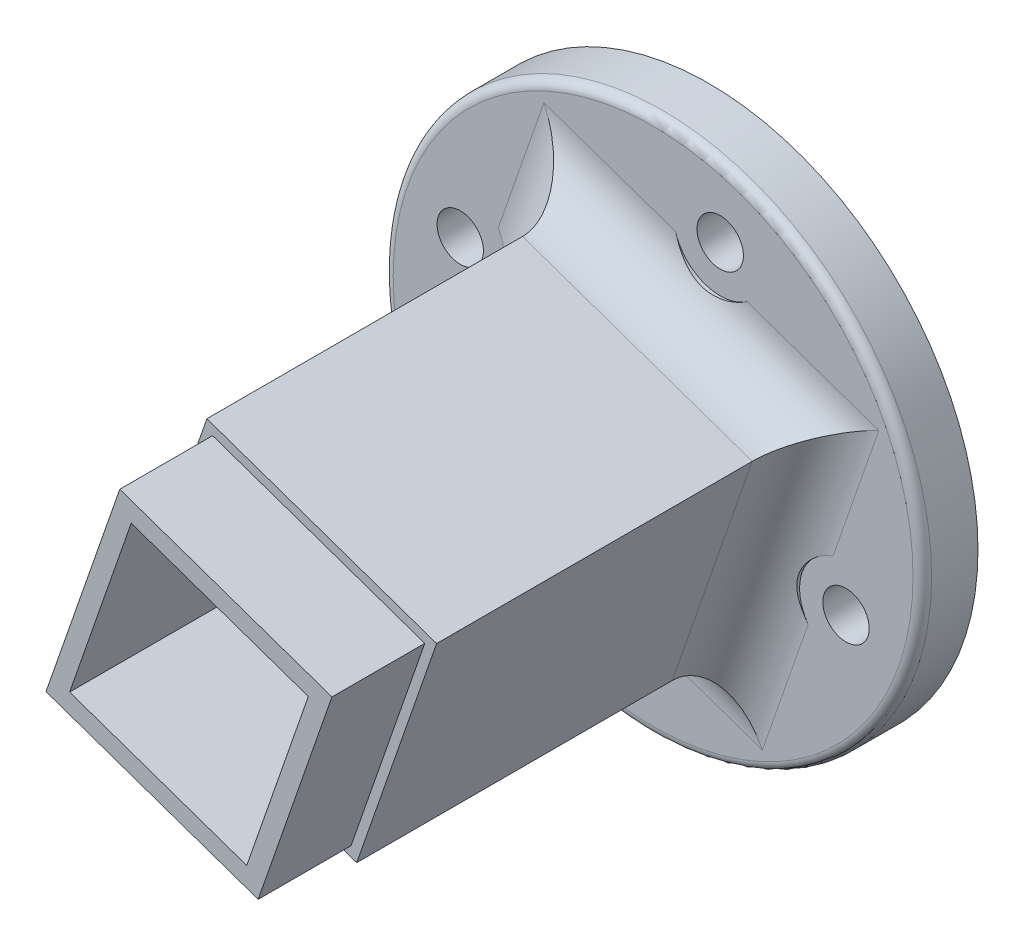
ISO-10303-21;
HEADER;
FILE_DESCRIPTION(('STEP AP214'),'2;1');
FILE_NAME('part.step','',(''),(''),'','','');
FILE_SCHEMA(('AUTOMOTIVE_DESIGN { 1 0 10303 214 1 1 1 1 }'));
ENDSEC;
DATA;
#1=APPLICATION_CONTEXT('core data for automotive mechanical design processes');
#2=APPLICATION_PROTOCOL_DEFINITION('international standard','automotive_design',2000,#1);
#3=PRODUCT_CONTEXT('',#1,'mechanical');
#4=PRODUCT('Part','Part','',(#3));
#5=PRODUCT_RELATED_PRODUCT_CATEGORY('part','',(#4));
#6=PRODUCT_DEFINITION_FORMATION('','',#4);
#7=PRODUCT_DEFINITION_CONTEXT('part definition',#1,'design');
#8=PRODUCT_DEFINITION('design','',#6,#7);
#9=PRODUCT_DEFINITION_SHAPE('','',#8);
#10=(LENGTH_UNIT() NAMED_UNIT(*) SI_UNIT(.MILLI.,.METRE.));
#11=(NAMED_UNIT(*) PLANE_ANGLE_UNIT() SI_UNIT($,.RADIAN.));
#12=(NAMED_UNIT(*) SI_UNIT($,.STERADIAN.) SOLID_ANGLE_UNIT());
#13=UNCERTAINTY_MEASURE_WITH_UNIT(LENGTH_MEASURE(1.E-05),#10,'distance_accuracy_value','');
#14=(GEOMETRIC_REPRESENTATION_CONTEXT(3) GLOBAL_UNCERTAINTY_ASSIGNED_CONTEXT((#13)) GLOBAL_UNIT_ASSIGNED_CONTEXT((#10,
#11,#12)) REPRESENTATION_CONTEXT('',''));
#15=CARTESIAN_POINT('',(0.,0.,0.));
#16=DIRECTION('',(0.,0.,1.));
#17=DIRECTION('',(1.,0.,0.));
#18=AXIS2_PLACEMENT_3D('',#15,#16,#17);
#19=CARTESIAN_POINT('',(11.9970562005532,-4.17186433693082,6.));
#20=DIRECTION('',(0.328448651359684,0.944521827921412,0.));
#21=DIRECTION('',(-0.944521827921412,0.328448651359684,0.));
#22=AXIS2_PLACEMENT_3D('',#19,#20,#21);
#23=CYLINDRICAL_SURFACE('',#22,3.);
#24=CARTESIAN_POINT('',(11.6307756899042,-5.22517947772395,3.));
#25=CARTESIAN_POINT('',(11.5646850556137,-5.24447174747941,2.99999779529976));
#26=CARTESIAN_POINT('',(11.4994485614502,-5.26648624751077,3.00157292741182));
#27=CARTESIAN_POINT('',(11.3711546456009,-5.31574938719057,3.00728692396962));
#28=CARTESIAN_POINT('',(11.3080955160881,-5.34299380938345,3.01142372860268));
#29=CARTESIAN_POINT('',(11.1231075009612,-5.43212912034422,3.02676499404451));
#30=CARTESIAN_POINT('',(11.0049612938838,-5.5015417335261,3.0409074883631));
#31=CARTESIAN_POINT('',(10.7821571684295,-5.65819214531964,3.07222296636819));
#32=CARTESIAN_POINT('',(10.6774696222362,-5.74538965763029,3.08938908915932));
#33=CARTESIAN_POINT('',(10.4834359214066,-5.93579433175635,3.1223386267483));
#34=CARTESIAN_POINT('',(10.3940966176944,-6.03900860397821,3.13812142254521));
#35=CARTESIAN_POINT('',(10.2300291009753,-6.26332333454375,3.16495280313421));
#36=CARTESIAN_POINT('',(10.1559934732688,-6.38495832625102,3.17579638156869));
#37=CARTESIAN_POINT('',(10.0295439674224,-6.63936497571262,3.18890260217315));
#38=CARTESIAN_POINT('',(9.97711520489635,-6.77212889092742,3.19117116027621));
#39=CARTESIAN_POINT('',(9.89801520294916,-7.03643976341352,3.18666939472255));
#40=CARTESIAN_POINT('',(9.87001202056088,-7.16760023109892,3.18042211847121));
#41=CARTESIAN_POINT('',(9.83529603314918,-7.4322853664651,3.16132618562236));
#42=CARTESIAN_POINT('',(9.8285971162037,-7.56581151931758,3.14847322917347));
#43=CARTESIAN_POINT('',(9.8364927461441,-7.83327256505783,3.11901718828624));
#44=CARTESIAN_POINT('',(9.85132411149217,-7.96719558658984,3.10237411992008));
#45=CARTESIAN_POINT('',(9.90225374606567,-8.23087633995418,3.06943000824341));
#46=CARTESIAN_POINT('',(9.93833290664605,-8.36063770403727,3.05312867123002));
#47=CARTESIAN_POINT('',(10.0226944525352,-8.59031066258724,3.02780688785079));
#48=CARTESIAN_POINT('',(10.0675956803639,-8.69138045546618,3.01800317619158));
#49=CARTESIAN_POINT('',(10.1705735073459,-8.8871256437384,3.00408983455342));
#50=CARTESIAN_POINT('',(10.2286668924862,-8.98179269121749,2.99998750690605));
#51=CARTESIAN_POINT('',(10.2929772783107,-9.07229468394499,3.));
#52=B_SPLINE_CURVE_WITH_KNOTS('',3,(#24,#25,#26,#27,#28,#29,#30,#31,#32,#33,#34,#35,#36,#37,#38,
#39,#40,#41,#42,#43,#44,#45,#46,#47,#48,#49,#50,#51),.UNSPECIFIED.,.F.,.F.,(4,2,2,2,2,2,2,2,2,2,
2,2,2,4),(0.,0.206371016757145,0.412576307941529,0.823732681234831,1.23396784659431,
1.64438565362716,2.07055936143632,2.49643899696413,2.89730581756551,3.29843390648876,
3.70400770092569,4.10921730904122,4.44123828706912,4.77368412682119),.UNSPECIFIED.);
#53=CARTESIAN_POINT('',(11.6307756899042,-5.22517947772395,3.));
#54=VERTEX_POINT('',#53);
#55=CARTESIAN_POINT('',(10.2929772783107,-9.07229468394499,3.));
#56=VERTEX_POINT('',#55);
#57=EDGE_CURVE('E12',#54,#56,#52,.T.);
#58=ORIENTED_EDGE('',*,*,#57,.F.);
#59=DIRECTION('',(0.328448651359684,0.944521827921412,0.));
#60=VECTOR('',#59,1.);
#61=CARTESIAN_POINT('',(10.9618764841075,-7.14873708083436,3.));
#62=LINE('',#61,#60);
#63=CARTESIAN_POINT('',(14.0985611045925,1.87144637581517,3.));
#64=VERTEX_POINT('',#63);
#65=EDGE_CURVE('E329',#64,#54,#62,.F.);
#66=ORIENTED_EDGE('',*,*,#65,.F.);
#67=CARTESIAN_POINT('',(14.0985611045925,1.87144637581517,6.));
#68=DIRECTION('',(-0.435629520853936,0.900126058149952,0.));
#69=DIRECTION('',(-0.900126058149951,-0.435629520853936,0.));
#70=AXIS2_PLACEMENT_3D('',#67,#68,#69);
#71=ELLIPSE('',#70,4.24264068711929,3.);
#72=CARTESIAN_POINT('',(10.2796496667492,0.023226846129978,6.));
#73=VERTEX_POINT('',#72);
#74=EDGE_CURVE('E354',#73,#64,#71,.F.);
#75=ORIENTED_EDGE('',*,*,#74,.F.);
#76=DIRECTION('',(0.328448651359684,0.944521827921412,0.));
#77=VECTOR('',#76,1.);
#78=CARTESIAN_POINT('',(9.16349071678902,-3.18651838285177,6.));
#79=LINE('',#78,#77);
#80=CARTESIAN_POINT('',(5.97697233393734,-12.3500090996405,6.));
#81=VERTEX_POINT('',#80);
#82=EDGE_CURVE('E343',#81,#73,#79,.T.);
#83=ORIENTED_EDGE('',*,*,#82,.F.);
#84=CARTESIAN_POINT('',(7.82519186362252,-16.1689205374838,6.));
#85=DIRECTION('',(0.900126058149951,0.435629520853936,0.));
#86=DIRECTION('',(0.435629520853936,-0.900126058149952,0.));
#87=AXIS2_PLACEMENT_3D('',#84,#85,#86);
#88=ELLIPSE('',#87,4.24264068711928,3.);
#89=CARTESIAN_POINT('',(7.82519186362252,-16.1689205374838,3.));
#90=VERTEX_POINT('',#89);
#91=EDGE_CURVE('E271',#90,#81,#88,.T.);
#92=ORIENTED_EDGE('',*,*,#91,.F.);
#93=EDGE_CURVE('E328',#56,#90,#62,.F.);
#94=ORIENTED_EDGE('',*,*,#93,.F.);
#95=EDGE_LOOP('',(#58,#66,#75,#83,#92,#94));
#96=FACE_BOUND('',#95,.T.);
#97=ADVANCED_FACE('F59',(#96),#23,.F.);
#98=CARTESIAN_POINT('',(-4.1718643369307,-11.997056200553,6.));
#99=DIRECTION('',(0.944521827921413,-0.328448651359681,0.));
#100=DIRECTION('',(0.328448651359681,0.944521827921413,0.));
#101=AXIS2_PLACEMENT_3D('',#98,#99,#100);
#102=CYLINDRICAL_SURFACE('',#101,3.);
#103=CARTESIAN_POINT('',(0.728566010083513,-13.7011351227956,3.));
#104=CARTESIAN_POINT('',(0.709273740328054,-13.6350444885051,2.99999779529976));
#105=CARTESIAN_POINT('',(0.687259240296701,-13.5698079943415,3.00157292741182));
#106=CARTESIAN_POINT('',(0.637996100616901,-13.4415140784922,3.00728692396962));
#107=CARTESIAN_POINT('',(0.610751678424025,-13.3784549489795,3.01142372860268));
#108=CARTESIAN_POINT('',(0.521616367463255,-13.1934669338526,3.02676499404451));
#109=CARTESIAN_POINT('',(0.452203754281387,-13.0753207267752,3.0409074883631));
#110=CARTESIAN_POINT('',(0.295553342487853,-12.8525166013209,3.0722229663682));
#111=CARTESIAN_POINT('',(0.208355830177201,-12.7478290551276,3.08938908915932));
#112=CARTESIAN_POINT('',(0.0179511560511513,-12.5537953542979,3.1223386267483));
#113=CARTESIAN_POINT('',(-0.0852631161707115,-12.4644560505858,3.13812142254522));
#114=CARTESIAN_POINT('',(-0.309577846736237,-12.3003885338666,3.16495280313422));
#115=CARTESIAN_POINT('',(-0.431212838443513,-12.2263529061602,3.17579638156871));
#116=CARTESIAN_POINT('',(-0.685619487905108,-12.0999034003138,3.18890260217316));
#117=CARTESIAN_POINT('',(-0.818383403119907,-12.0474746377877,3.19117116027623));
#118=CARTESIAN_POINT('',(-1.082694275606,-11.9683746358405,3.18666939472257));
#119=CARTESIAN_POINT('',(-1.2138547432914,-11.9403714534522,3.18042211847123));
#120=CARTESIAN_POINT('',(-1.47853987865758,-11.9056554660405,3.16132618562239));
#121=CARTESIAN_POINT('',(-1.61206603151006,-11.898956549095,3.1484732291735));
#122=CARTESIAN_POINT('',(-1.87952707725031,-11.9068521790354,3.11901718828627));
#123=CARTESIAN_POINT('',(-2.01345009878231,-11.9216835443835,3.1023741199201));
#124=CARTESIAN_POINT('',(-2.27713085214666,-11.972613178957,3.06943000824343));
#125=CARTESIAN_POINT('',(-2.40689221622975,-12.0086923395373,3.05312867123004));
#126=CARTESIAN_POINT('',(-2.63656517477975,-12.0930538854265,3.0278068878508));
#127=CARTESIAN_POINT('',(-2.73763496765871,-12.1379551132552,3.01800317619159));
#128=CARTESIAN_POINT('',(-2.93338015593098,-12.2409329402372,3.00408983455342));
#129=CARTESIAN_POINT('',(-3.02804720341009,-12.2990263253776,2.99998750690606));
#130=CARTESIAN_POINT('',(-3.11854919613761,-12.3633367112021,3.));
#131=B_SPLINE_CURVE_WITH_KNOTS('',3,(#103,#104,#105,#106,#107,#108,#109,#110,#111,#112,#113,
#114,#115,#116,#117,#118,#119,#120,#121,#122,#123,#124,#125,#126,#127,#128,#129,#130),
.UNSPECIFIED.,.F.,.F.,(4,2,2,2,2,2,2,2,2,2,2,2,2,4),(0.,0.206371016757143,0.412576307941529,
0.823732681234828,1.2339678465943,1.64438565362715,2.07055936143632,2.49643899696412,
2.89730581756551,3.29843390648876,3.70400770092568,4.1092173090412,4.44123828706919,
4.77368412682134),.UNSPECIFIED.);
#132=CARTESIAN_POINT('',(0.728566010083512,-13.7011351227956,3.));
#133=VERTEX_POINT('',#132);
#134=CARTESIAN_POINT('',(-3.1185491961376,-12.3633367112021,3.));
#135=VERTEX_POINT('',#134);
#136=EDGE_CURVE('E72',#133,#135,#131,.T.);
#137=ORIENTED_EDGE('',*,*,#136,.F.);
#138=DIRECTION('',(0.944521827921413,-0.328448651359681,0.));
#139=VECTOR('',#138,1.);
#140=CARTESIAN_POINT('',(-1.19499159302687,-13.0322359169989,3.));
#141=LINE('',#140,#139);
#142=EDGE_CURVE('E325',#90,#133,#141,.F.);
#143=ORIENTED_EDGE('',*,*,#142,.F.);
#144=ORIENTED_EDGE('',*,*,#91,.T.);
#145=DIRECTION('',(0.944521827921413,-0.328448651359681,0.));
#146=VECTOR('',#145,1.);
#147=CARTESIAN_POINT('',(-3.18651838285166,-9.16349071678879,6.));
#148=LINE('',#147,#146);
#149=CARTESIAN_POINT('',(-6.39626361183306,-8.04733176682874,6.));
#150=VERTEX_POINT('',#149);
#151=EDGE_CURVE('E347',#150,#81,#148,.T.);
#152=ORIENTED_EDGE('',*,*,#151,.F.);
#153=CARTESIAN_POINT('',(-10.2151750496763,-9.89555129651394,6.));
#154=DIRECTION('',(0.43562952085394,-0.90012605814995,0.));
#155=DIRECTION('',(0.90012605814995,0.43562952085394,0.));
#156=AXIS2_PLACEMENT_3D('',#153,#154,#155);
#157=ELLIPSE('',#156,4.24264068711928,3.);
#158=CARTESIAN_POINT('',(-10.2151750496763,-9.89555129651394,3.));
#159=VERTEX_POINT('',#158);
#160=EDGE_CURVE('E352',#159,#150,#157,.T.);
#161=ORIENTED_EDGE('',*,*,#160,.F.);
#162=EDGE_CURVE('E324',#135,#159,#141,.F.);
#163=ORIENTED_EDGE('',*,*,#162,.F.);
#164=EDGE_LOOP('',(#137,#143,#144,#152,#161,#163));
#165=FACE_BOUND('',#164,.T.);
#166=ADVANCED_FACE('F405',(#165),#102,.F.);
#167=CARTESIAN_POINT('',(5.07837764794304,5.00813099630011,6.));
#168=DIRECTION('',(-0.944521827921413,0.328448651359681,0.));
#169=DIRECTION('',(-0.328448651359681,-0.944521827921413,0.));
#170=AXIS2_PLACEMENT_3D('',#167,#168,#169);
#171=CYLINDRICAL_SURFACE('',#170,3.);
#172=CARTESIAN_POINT('',(3.15482004483256,5.67703020209683,3.));
#173=CARTESIAN_POINT('',(3.17411231458801,5.61093956780636,2.99999779529976));
#174=CARTESIAN_POINT('',(3.19612681461937,5.54570307364279,3.00157292741183));
#175=CARTESIAN_POINT('',(3.24538995429916,5.41740915779351,3.00728692396962));
#176=CARTESIAN_POINT('',(3.27263437649204,5.35435002828072,3.01142372860268));
#177=CARTESIAN_POINT('',(3.3617696874528,5.16936201315386,3.02676499404451));
#178=CARTESIAN_POINT('',(3.43118230063467,5.05121580607644,3.0409074883631));
#179=CARTESIAN_POINT('',(3.5878327124282,4.82841168062217,3.0722229663682));
#180=CARTESIAN_POINT('',(3.67503022473885,4.72372413442886,3.08938908915933));
#181=CARTESIAN_POINT('',(3.86543489886489,4.52969043359918,3.12233862674831));
#182=CARTESIAN_POINT('',(3.96864917108675,4.44035112988701,3.13812142254523));
#183=CARTESIAN_POINT('',(4.19296390165227,4.27628361316785,3.16495280313423));
#184=CARTESIAN_POINT('',(4.31459889335955,4.20224798546142,3.17579638156872));
#185=CARTESIAN_POINT('',(4.56900554282114,4.07579847961502,3.18890260217318));
#186=CARTESIAN_POINT('',(4.70176945803594,4.02336971708892,3.19117116027624));
#187=CARTESIAN_POINT('',(4.96608033052203,3.94426971514172,3.1866693947226));
#188=CARTESIAN_POINT('',(5.09724079820743,3.91626653275343,3.18042211847125));
#189=CARTESIAN_POINT('',(5.36192593357361,3.88155054534171,3.16132618562241));
#190=CARTESIAN_POINT('',(5.49545208642609,3.87485162839623,3.14847322917352));
#191=CARTESIAN_POINT('',(5.76291313216634,3.88274725833661,3.11901718828629));
#192=CARTESIAN_POINT('',(5.89683615369834,3.89757862368468,3.10237411992012));
#193=CARTESIAN_POINT('',(6.16051690706268,3.94850825825816,3.06943000824345));
#194=CARTESIAN_POINT('',(6.29027827114577,3.98458741883853,3.05312867123006));
#195=CARTESIAN_POINT('',(6.51995122969579,4.06894896472769,3.02780688785081));
#196=CARTESIAN_POINT('',(6.62102102257477,4.11385019255642,3.01800317619159));
#197=CARTESIAN_POINT('',(6.81676621084707,4.21682801953845,3.00408983455342));
#198=CARTESIAN_POINT('',(6.9114332583262,4.27492140467881,2.99998750690606));
#199=CARTESIAN_POINT('',(7.00193525105373,4.33923179050332,3.));
#200=B_SPLINE_CURVE_WITH_KNOTS('',3,(#172,#173,#174,#175,#176,#177,#178,#179,#180,#181,#182,
#183,#184,#185,#186,#187,#188,#189,#190,#191,#192,#193,#194,#195,#196,#197,#198,#199),
.UNSPECIFIED.,.F.,.F.,(4,2,2,2,2,2,2,2,2,2,2,2,2,4),(0.,0.206371016757143,0.412576307941527,
0.823732681234825,1.2339678465943,1.64438565362715,2.07055936143631,2.49643899696412,
2.89730581756551,3.29843390648876,3.70400770092568,4.10921730904119,4.44123828706924,
4.77368412682145),.UNSPECIFIED.);
#201=CARTESIAN_POINT('',(3.15482004483256,5.67703020209683,3.));
#202=VERTEX_POINT('',#201);
#203=CARTESIAN_POINT('',(7.00193525105373,4.33923179050332,3.));
#204=VERTEX_POINT('',#203);
#205=EDGE_CURVE('E367',#202,#204,#200,.T.);
#206=ORIENTED_EDGE('',*,*,#205,.F.);
#207=DIRECTION('',(0.944521827921413,-0.328448651359681,0.));
#208=VECTOR('',#207,1.);
#209=CARTESIAN_POINT('',(11.2649956208282,2.85679232989422,3.));
#210=LINE('',#209,#208);
#211=CARTESIAN_POINT('',(-3.94180580870649,8.14481561678507,3.));
#212=VERTEX_POINT('',#211);
#213=EDGE_CURVE('E337',#212,#202,#210,.T.);
#214=ORIENTED_EDGE('',*,*,#213,.F.);
#215=CARTESIAN_POINT('',(-3.94180580870649,8.14481561678507,6.));
#216=DIRECTION('',(-0.90012605814995,-0.43562952085394,0.));
#217=DIRECTION('',(-0.43562952085394,0.90012605814995,0.));
#218=AXIS2_PLACEMENT_3D('',#215,#216,#217);
#219=ELLIPSE('',#218,4.24264068711929,3.);
#220=CARTESIAN_POINT('',(-2.09358627902128,4.32590417894179,6.));
#221=VERTEX_POINT('',#220);
#222=EDGE_CURVE('E250',#221,#212,#219,.F.);
#223=ORIENTED_EDGE('',*,*,#222,.F.);
#224=DIRECTION('',(0.944521827921413,-0.328448651359681,0.));
#225=VECTOR('',#224,1.);
#226=CARTESIAN_POINT('',(-2.09358627902129,4.32590417894179,6.));
#227=LINE('',#226,#225);
#228=EDGE_CURVE('E345',#73,#221,#227,.F.);
#229=ORIENTED_EDGE('',*,*,#228,.F.);
#230=ORIENTED_EDGE('',*,*,#74,.T.);
#231=EDGE_CURVE('E336',#204,#64,#210,.T.);
#232=ORIENTED_EDGE('',*,*,#231,.F.);
#233=EDGE_LOOP('',(#206,#214,#223,#229,#230,#232));
#234=FACE_BOUND('',#233,.T.);
#235=ADVANCED_FACE('F408',(#234),#171,.F.);
#236=CARTESIAN_POINT('',(-7.07849042919143,-0.875367839864484,6.));
#237=DIRECTION('',(-0.328448651359677,-0.944521827921414,0.));
#238=DIRECTION('',(0.944521827921414,-0.328448651359677,0.));
#239=AXIS2_PLACEMENT_3D('',#236,#237,#238);
#240=CYLINDRICAL_SURFACE('',#239,3.);
#241=CARTESIAN_POINT('',(-7.74738963498814,-2.79892544297495,3.));
#242=CARTESIAN_POINT('',(-7.68129900069767,-2.7796331732195,2.99999779529976));
#243=CARTESIAN_POINT('',(-7.6160625065341,-2.75761867318814,3.00157292741183));
#244=CARTESIAN_POINT('',(-7.48776859068482,-2.70835553350834,3.00728692396962));
#245=CARTESIAN_POINT('',(-7.42470946117203,-2.68111111131547,3.01142372860268));
#246=CARTESIAN_POINT('',(-7.23972144604517,-2.5919758003547,3.02676499404451));
#247=CARTESIAN_POINT('',(-7.12157523896775,-2.52256318717283,3.0409074883631));
#248=CARTESIAN_POINT('',(-6.89877111351349,-2.3659127753793,3.0722229663682));
#249=CARTESIAN_POINT('',(-6.79408356732017,-2.27871526306865,3.08938908915933));
#250=CARTESIAN_POINT('',(-6.6000498664905,-2.0883105889426,3.12233862674831));
#251=CARTESIAN_POINT('',(-6.51071056277833,-1.98509631672074,3.13812142254522));
#252=CARTESIAN_POINT('',(-6.34664304605918,-1.76078158615522,3.16495280313423));
#253=CARTESIAN_POINT('',(-6.27260741835274,-1.63914659444794,3.17579638156872));
#254=CARTESIAN_POINT('',(-6.14615791250634,-1.38473994498635,3.18890260217317));
#255=CARTESIAN_POINT('',(-6.09372914998025,-1.25197602977155,3.19117116027624));
#256=CARTESIAN_POINT('',(-6.01462914803305,-0.987665157285456,3.18666939472259));
#257=CARTESIAN_POINT('',(-5.98662596564477,-0.856504689600055,3.18042211847125));
#258=CARTESIAN_POINT('',(-5.95190997823305,-0.591819554233877,3.1613261856224));
#259=CARTESIAN_POINT('',(-5.94521106128757,-0.458293401381396,3.14847322917351));
#260=CARTESIAN_POINT('',(-5.95310669122796,-0.190832355641145,3.11901718828628));
#261=CARTESIAN_POINT('',(-5.96793805657602,-0.0569093341091458,3.10237411992011));
#262=CARTESIAN_POINT('',(-6.01886769114951,0.206771419255197,3.06943000824344));
#263=CARTESIAN_POINT('',(-6.05494685172989,0.336532783338289,3.05312867123005));
#264=CARTESIAN_POINT('',(-6.13930839761904,0.566205741888295,3.02780688785081));
#265=CARTESIAN_POINT('',(-6.18420962544777,0.667275534767266,3.01800317619159));
#266=CARTESIAN_POINT('',(-6.28718745242979,0.863020723039555,3.00408983455342));
#267=CARTESIAN_POINT('',(-6.34528083757015,0.957687770518675,2.99998750690606));
#268=CARTESIAN_POINT('',(-6.40959122339465,1.0481897632462,3.));
#269=B_SPLINE_CURVE_WITH_KNOTS('',3,(#241,#242,#243,#244,#245,#246,#247,#248,#249,#250,#251,
#252,#253,#254,#255,#256,#257,#258,#259,#260,#261,#262,#263,#264,#265,#266,#267,#268),
.UNSPECIFIED.,.F.,.F.,(4,2,2,2,2,2,2,2,2,2,2,2,2,4),(0.,0.206371016757144,0.412576307941528,
0.823732681234826,1.2339678465943,1.64438565362715,2.07055936143631,2.49643899696412,
2.89730581756551,3.29843390648876,3.70400770092568,4.1092173090412,4.44123828706922,
4.7736841268214),.UNSPECIFIED.);
#270=CARTESIAN_POINT('',(-7.74738963498814,-2.79892544297495,3.));
#271=VERTEX_POINT('',#270);
#272=CARTESIAN_POINT('',(-6.40959122339465,1.0481897632462,3.));
#273=VERTEX_POINT('',#272);
#274=EDGE_CURVE('E349',#271,#273,#269,.T.);
#275=ORIENTED_EDGE('',*,*,#274,.F.);
#276=DIRECTION('',(0.328448651359677,0.944521827921414,0.));
#277=VECTOR('',#276,1.);
#278=CARTESIAN_POINT('',(-4.92715176278553,5.31125013302082,3.));
#279=LINE('',#278,#277);
#280=EDGE_CURVE('E333',#159,#271,#279,.T.);
#281=ORIENTED_EDGE('',*,*,#280,.F.);
#282=ORIENTED_EDGE('',*,*,#160,.T.);
#283=DIRECTION('',(0.328448651359677,0.944521827921414,0.));
#284=VECTOR('',#283,1.);
#285=CARTESIAN_POINT('',(-6.39626361183306,-8.04733176682874,6.));
#286=LINE('',#285,#284);
#287=EDGE_CURVE('E340',#221,#150,#286,.F.);
#288=ORIENTED_EDGE('',*,*,#287,.F.);
#289=ORIENTED_EDGE('',*,*,#222,.T.);
#290=EDGE_CURVE('E332',#273,#212,#279,.T.);
#291=ORIENTED_EDGE('',*,*,#290,.F.);
#292=EDGE_LOOP('',(#275,#281,#282,#288,#289,#291));
#293=FACE_BOUND('',#292,.T.);
#294=ADVANCED_FACE('F374',(#293),#240,.F.);
#295=CARTESIAN_POINT('',(1.94169302745808,-4.0120524603494,3.));
#296=DIRECTION('',(0.,0.,1.));
#297=DIRECTION('',(1.,0.,0.));
#298=AXIS2_PLACEMENT_3D('',#295,#296,#297);
#299=PLANE('',#298);
#300=ORIENTED_EDGE('',*,*,#280,.T.);
#301=CARTESIAN_POINT('',(-8.44804707967744,-0.399117295392847,3.));
#302=DIRECTION('',(0.,0.,1.));
#303=DIRECTION('',(1.,0.,0.));
#304=AXIS2_PLACEMENT_3D('',#301,#302,#303);
#305=CIRCLE('',#304,2.5);
#306=EDGE_CURVE('E248',#271,#273,#305,.T.);
#307=ORIENTED_EDGE('',*,*,#306,.T.);
#308=ORIENTED_EDGE('',*,*,#290,.T.);
#309=ORIENTED_EDGE('',*,*,#213,.T.);
#310=CARTESIAN_POINT('',(5.55462819241467,6.37768764678609,3.));
#311=DIRECTION('',(0.,0.,1.));
#312=DIRECTION('',(1.,0.,0.));
#313=AXIS2_PLACEMENT_3D('',#310,#311,#312);
#314=CIRCLE('',#313,2.5);
#315=EDGE_CURVE('E251',#202,#204,#314,.T.);
#316=ORIENTED_EDGE('',*,*,#315,.T.);
#317=ORIENTED_EDGE('',*,*,#231,.T.);
#318=ORIENTED_EDGE('',*,*,#65,.T.);
#319=CARTESIAN_POINT('',(12.3314331345936,-7.62498762530604,3.));
#320=DIRECTION('',(0.,0.,1.));
#321=DIRECTION('',(1.,0.,0.));
#322=AXIS2_PLACEMENT_3D('',#319,#320,#321);
#323=CIRCLE('',#322,2.5);
#324=EDGE_CURVE('E253',#54,#56,#323,.T.);
#325=ORIENTED_EDGE('',*,*,#324,.T.);
#326=ORIENTED_EDGE('',*,*,#93,.T.);
#327=ORIENTED_EDGE('',*,*,#142,.T.);
#328=CARTESIAN_POINT('',(-1.67124213749859,-14.4017925674849,3.));
#329=DIRECTION('',(0.,0.,1.));
#330=DIRECTION('',(1.,0.,0.));
#331=AXIS2_PLACEMENT_3D('',#328,#329,#330);
#332=CIRCLE('',#331,2.5);
#333=EDGE_CURVE('E247',#133,#135,#332,.T.);
#334=ORIENTED_EDGE('',*,*,#333,.T.);
#335=ORIENTED_EDGE('',*,*,#162,.T.);
#336=EDGE_LOOP('',(#300,#307,#308,#309,#316,#317,#318,#325,#326,#327,#334,#335));
#337=FACE_BOUND('',#336,.T.);
#338=CARTESIAN_POINT('',(1.94169302745808,-4.0120524603494,3.));
#339=DIRECTION('',(0.,0.,1.));
#340=DIRECTION('',(1.,0.,0.));
#341=AXIS2_PLACEMENT_3D('',#338,#339,#340);
#342=CIRCLE('',#341,14.);
#343=CARTESIAN_POINT('',(15.9416930274581,-4.0120524603494,3.));
#344=VERTEX_POINT('',#343);
#345=EDGE_CURVE('E318',#344,#344,#342,.T.);
#346=ORIENTED_EDGE('',*,*,#345,.T.);
#347=EDGE_LOOP('',(#346));
#348=FACE_BOUND('',#347,.T.);
#349=CARTESIAN_POINT('',(-1.67124213749845,-14.4017925674849,3.));
#350=DIRECTION('',(0.,0.,1.));
#351=DIRECTION('',(1.,0.,0.));
#352=AXIS2_PLACEMENT_3D('',#349,#350,#351);
#353=CIRCLE('',#352,1.25);
#354=CARTESIAN_POINT('',(-0.421242137498447,-14.4017925674849,3.));
#355=VERTEX_POINT('',#354);
#356=EDGE_CURVE('E298',#355,#355,#353,.T.);
#357=ORIENTED_EDGE('',*,*,#356,.F.);
#358=EDGE_LOOP('',(#357));
#359=FACE_BOUND('',#358,.T.);
#360=CARTESIAN_POINT('',(12.3314331345936,-7.62498762530589,3.));
#361=DIRECTION('',(0.,0.,1.));
#362=DIRECTION('',(1.,0.,0.));
#363=AXIS2_PLACEMENT_3D('',#360,#361,#362);
#364=CIRCLE('',#363,1.25);
#365=CARTESIAN_POINT('',(13.5814331345936,-7.62498762530589,3.));
#366=VERTEX_POINT('',#365);
#367=EDGE_CURVE('E304',#366,#366,#364,.T.);
#368=ORIENTED_EDGE('',*,*,#367,.F.);
#369=EDGE_LOOP('',(#368));
#370=FACE_BOUND('',#369,.T.);
#371=CARTESIAN_POINT('',(5.55462819241453,6.37768764678615,3.));
#372=DIRECTION('',(0.,0.,1.));
#373=DIRECTION('',(1.,0.,0.));
#374=AXIS2_PLACEMENT_3D('',#371,#372,#373);
#375=CIRCLE('',#374,1.25);
#376=CARTESIAN_POINT('',(6.80462819241453,6.37768764678615,3.));
#377=VERTEX_POINT('',#376);
#378=EDGE_CURVE('E310',#377,#377,#375,.T.);
#379=ORIENTED_EDGE('',*,*,#378,.F.);
#380=EDGE_LOOP('',(#379));
#381=FACE_BOUND('',#380,.T.);
#382=CARTESIAN_POINT('',(-8.44804707967744,-0.399117295392847,3.));
#383=DIRECTION('',(0.,0.,1.));
#384=DIRECTION('',(1.,0.,0.));
#385=AXIS2_PLACEMENT_3D('',#382,#383,#384);
#386=CIRCLE('',#385,1.25);
#387=CARTESIAN_POINT('',(-7.19804707967743,-0.399117295392847,3.));
#388=VERTEX_POINT('',#387);
#389=EDGE_CURVE('E292',#388,#388,#386,.T.);
#390=ORIENTED_EDGE('',*,*,#389,.F.);
#391=EDGE_LOOP('',(#390));
#392=FACE_BOUND('',#391,.T.);
#393=ADVANCED_FACE('F416',(#337,#348,#359,#370,#381,#392),#299,.T.);
#394=CARTESIAN_POINT('',(1.94169302745808,-4.0120524603494,0.));
#395=DIRECTION('',(0.,0.,1.));
#396=DIRECTION('',(1.,0.,0.));
#397=AXIS2_PLACEMENT_3D('',#394,#395,#396);
#398=PLANE('',#397);
#399=CARTESIAN_POINT('',(1.94169302745808,-4.0120524603494,0.));
#400=DIRECTION('',(0.,0.,1.));
#401=DIRECTION('',(1.,0.,0.));
#402=AXIS2_PLACEMENT_3D('',#399,#400,#401);
#403=CIRCLE('',#402,14.5);
#404=CARTESIAN_POINT('',(16.4416930274581,-4.0120524603494,0.));
#405=VERTEX_POINT('',#404);
#406=EDGE_CURVE('E313',#405,#405,#403,.T.);
#407=ORIENTED_EDGE('',*,*,#406,.F.);
#408=EDGE_LOOP('',(#407));
#409=FACE_BOUND('',#408,.T.);
#410=CARTESIAN_POINT('',(5.55462819241453,6.37768764678615,0.));
#411=DIRECTION('',(0.,0.,1.));
#412=DIRECTION('',(1.,0.,0.));
#413=AXIS2_PLACEMENT_3D('',#410,#411,#412);
#414=CIRCLE('',#413,1.25);
#415=CARTESIAN_POINT('',(6.80462819241453,6.37768764678615,0.));
#416=VERTEX_POINT('',#415);
#417=EDGE_CURVE('E307',#416,#416,#414,.T.);
#418=ORIENTED_EDGE('',*,*,#417,.T.);
#419=EDGE_LOOP('',(#418));
#420=FACE_BOUND('',#419,.T.);
#421=CARTESIAN_POINT('',(12.3314331345936,-7.62498762530589,0.));
#422=DIRECTION('',(0.,0.,1.));
#423=DIRECTION('',(1.,0.,0.));
#424=AXIS2_PLACEMENT_3D('',#421,#422,#423);
#425=CIRCLE('',#424,1.25);
#426=CARTESIAN_POINT('',(13.5814331345936,-7.62498762530589,0.));
#427=VERTEX_POINT('',#426);
#428=EDGE_CURVE('E301',#427,#427,#425,.T.);
#429=ORIENTED_EDGE('',*,*,#428,.T.);
#430=EDGE_LOOP('',(#429));
#431=FACE_BOUND('',#430,.T.);
#432=CARTESIAN_POINT('',(-1.67124213749845,-14.4017925674849,0.));
#433=DIRECTION('',(0.,0.,1.));
#434=DIRECTION('',(1.,0.,0.));
#435=AXIS2_PLACEMENT_3D('',#432,#433,#434);
#436=CIRCLE('',#435,1.25);
#437=CARTESIAN_POINT('',(-0.421242137498447,-14.4017925674849,0.));
#438=VERTEX_POINT('',#437);
#439=EDGE_CURVE('E295',#438,#438,#436,.T.);
#440=ORIENTED_EDGE('',*,*,#439,.T.);
#441=EDGE_LOOP('',(#440));
#442=FACE_BOUND('',#441,.T.);
#443=CARTESIAN_POINT('',(-8.44804707967744,-0.399117295392847,0.));
#444=DIRECTION('',(0.,0.,1.));
#445=DIRECTION('',(1.,0.,0.));
#446=AXIS2_PLACEMENT_3D('',#443,#444,#445);
#447=CIRCLE('',#446,1.25);
#448=CARTESIAN_POINT('',(-7.19804707967743,-0.399117295392847,0.));
#449=VERTEX_POINT('',#448);
#450=EDGE_CURVE('E281',#449,#449,#447,.T.);
#451=ORIENTED_EDGE('',*,*,#450,.T.);
#452=EDGE_LOOP('',(#451));
#453=FACE_BOUND('',#452,.T.);
#454=ADVANCED_FACE('F492',(#409,#420,#431,#442,#453),#398,.F.);
#455=CARTESIAN_POINT('',(1.94169302745808,-4.0120524603494,3.));
#456=DIRECTION('',(0.,0.,-1.));
#457=DIRECTION('',(-1.,0.,0.));
#458=AXIS2_PLACEMENT_3D('',#455,#456,#457);
#459=CYLINDRICAL_SURFACE('',#458,14.5);
#460=CARTESIAN_POINT('',(1.94169302745808,-4.0120524603494,2.5));
#461=DIRECTION('',(0.,0.,1.));
#462=DIRECTION('',(1.,0.,0.));
#463=AXIS2_PLACEMENT_3D('',#460,#461,#462);
#464=CIRCLE('',#463,14.5);
#465=CARTESIAN_POINT('',(16.4416930274581,-4.0120524603494,2.5));
#466=VERTEX_POINT('',#465);
#467=EDGE_CURVE('E321',#466,#466,#464,.F.);
#468=ORIENTED_EDGE('',*,*,#467,.T.);
#469=EDGE_LOOP('',(#468));
#470=FACE_BOUND('',#469,.T.);
#471=ORIENTED_EDGE('',*,*,#406,.T.);
#472=EDGE_LOOP('',(#471));
#473=FACE_BOUND('',#472,.T.);
#474=ADVANCED_FACE('F486',(#470,#473),#459,.T.);
#475=CARTESIAN_POINT('',(5.55462819241453,6.37768764678615,3.));
#476=DIRECTION('',(0.,0.,-1.));
#477=DIRECTION('',(-1.,0.,0.));
#478=AXIS2_PLACEMENT_3D('',#475,#476,#477);
#479=CYLINDRICAL_SURFACE('',#478,1.25);
#480=ORIENTED_EDGE('',*,*,#378,.T.);
#481=EDGE_LOOP('',(#480));
#482=FACE_BOUND('',#481,.T.);
#483=ORIENTED_EDGE('',*,*,#417,.F.);
#484=EDGE_LOOP('',(#483));
#485=FACE_BOUND('',#484,.T.);
#486=ADVANCED_FACE('F482',(#482,#485),#479,.F.);
#487=CARTESIAN_POINT('',(12.3314331345936,-7.62498762530589,3.));
#488=DIRECTION('',(0.,0.,-1.));
#489=DIRECTION('',(-1.,0.,0.));
#490=AXIS2_PLACEMENT_3D('',#487,#488,#489);
#491=CYLINDRICAL_SURFACE('',#490,1.25);
#492=ORIENTED_EDGE('',*,*,#367,.T.);
#493=EDGE_LOOP('',(#492));
#494=FACE_BOUND('',#493,.T.);
#495=ORIENTED_EDGE('',*,*,#428,.F.);
#496=EDGE_LOOP('',(#495));
#497=FACE_BOUND('',#496,.T.);
#498=ADVANCED_FACE('F478',(#494,#497),#491,.F.);
#499=CARTESIAN_POINT('',(-1.67124213749845,-14.4017925674849,3.));
#500=DIRECTION('',(0.,0.,-1.));
#501=DIRECTION('',(-1.,0.,0.));
#502=AXIS2_PLACEMENT_3D('',#499,#500,#501);
#503=CYLINDRICAL_SURFACE('',#502,1.25);
#504=ORIENTED_EDGE('',*,*,#356,.T.);
#505=EDGE_LOOP('',(#504));
#506=FACE_BOUND('',#505,.T.);
#507=ORIENTED_EDGE('',*,*,#439,.F.);
#508=EDGE_LOOP('',(#507));
#509=FACE_BOUND('',#508,.T.);
#510=ADVANCED_FACE('F474',(#506,#509),#503,.F.);
#511=CARTESIAN_POINT('',(-8.44804707967744,-0.399117295392847,3.));
#512=DIRECTION('',(0.,0.,-1.));
#513=DIRECTION('',(-1.,0.,0.));
#514=AXIS2_PLACEMENT_3D('',#511,#512,#513);
#515=CYLINDRICAL_SURFACE('',#514,1.25);
#516=ORIENTED_EDGE('',*,*,#389,.T.);
#517=EDGE_LOOP('',(#516));
#518=FACE_BOUND('',#517,.T.);
#519=ORIENTED_EDGE('',*,*,#450,.F.);
#520=EDGE_LOOP('',(#519));
#521=FACE_BOUND('',#520,.T.);
#522=ADVANCED_FACE('F471',(#518,#521),#515,.F.);
#523=CARTESIAN_POINT('',(1.94169302745808,-4.0120524603494,2.5));
#524=DIRECTION('',(0.,0.,1.));
#525=DIRECTION('',(1.,0.,0.));
#526=AXIS2_PLACEMENT_3D('',#523,#524,#525);
#527=TOROIDAL_SURFACE('',#526,14.,0.5);
#528=ORIENTED_EDGE('',*,*,#467,.F.);
#529=EDGE_LOOP('',(#528));
#530=FACE_BOUND('',#529,.T.);
#531=ORIENTED_EDGE('',*,*,#345,.F.);
#532=EDGE_LOOP('',(#531));
#533=FACE_BOUND('',#532,.T.);
#534=ADVANCED_FACE('F467',(#530,#533),#527,.T.);
#535=CARTESIAN_POINT('',(-3.18651838285166,-9.16349071678879,23.));
#536=DIRECTION('',(0.328448651359681,0.944521827921413,0.));
#537=DIRECTION('',(-0.944521827921413,0.328448651359681,0.));
#538=AXIS2_PLACEMENT_3D('',#535,#536,#537);
#539=PLANE('',#538);
#540=DIRECTION('',(0.,0.,-1.));
#541=VECTOR('',#540,1.);
#542=CARTESIAN_POINT('',(-6.39626361183306,-8.04733176682874,23.));
#543=LINE('',#542,#541);
#544=CARTESIAN_POINT('',(-6.39626361183306,-8.04733176682874,23.));
#545=VERTEX_POINT('',#544);
#546=EDGE_CURVE('E267',#545,#150,#543,.T.);
#547=ORIENTED_EDGE('',*,*,#546,.T.);
#548=ORIENTED_EDGE('',*,*,#151,.T.);
#549=DIRECTION('',(0.,0.,-1.));
#550=VECTOR('',#549,1.);
#551=CARTESIAN_POINT('',(5.97697233393734,-12.3500090996405,23.));
#552=LINE('',#551,#550);
#553=CARTESIAN_POINT('',(5.97697233393734,-12.3500090996405,23.));
#554=VERTEX_POINT('',#553);
#555=EDGE_CURVE('E199',#554,#81,#552,.T.);
#556=ORIENTED_EDGE('',*,*,#555,.F.);
#557=DIRECTION('',(0.944521827921413,-0.328448651359681,0.));
#558=VECTOR('',#557,1.);
#559=CARTESIAN_POINT('',(-3.18651838285166,-9.16349071678879,23.));
#560=LINE('',#559,#558);
#561=EDGE_CURVE('E256',#545,#554,#560,.T.);
#562=ORIENTED_EDGE('',*,*,#561,.F.);
#563=EDGE_LOOP('',(#547,#548,#556,#562));
#564=FACE_BOUND('',#563,.T.);
#565=ADVANCED_FACE('F452',(#564),#539,.F.);
#566=CARTESIAN_POINT('',(9.16349071678902,-3.18651838285177,23.));
#567=DIRECTION('',(-0.944521827921412,0.328448651359684,0.));
#568=DIRECTION('',(-0.328448651359684,-0.944521827921412,0.));
#569=AXIS2_PLACEMENT_3D('',#566,#567,#568);
#570=PLANE('',#569);
#571=ORIENTED_EDGE('',*,*,#555,.T.);
#572=ORIENTED_EDGE('',*,*,#82,.T.);
#573=DIRECTION('',(0.,0.,-1.));
#574=VECTOR('',#573,1.);
#575=CARTESIAN_POINT('',(10.2796496667492,0.023226846129978,23.));
#576=LINE('',#575,#574);
#577=CARTESIAN_POINT('',(10.2796496667492,0.023226846129978,23.));
#578=VERTEX_POINT('',#577);
#579=EDGE_CURVE('E287',#578,#73,#576,.T.);
#580=ORIENTED_EDGE('',*,*,#579,.F.);
#581=DIRECTION('',(0.328448651359684,0.944521827921412,0.));
#582=VECTOR('',#581,1.);
#583=CARTESIAN_POINT('',(9.16349071678902,-3.18651838285177,23.));
#584=LINE('',#583,#582);
#585=EDGE_CURVE('E259',#554,#578,#584,.T.);
#586=ORIENTED_EDGE('',*,*,#585,.F.);
#587=EDGE_LOOP('',(#571,#572,#580,#586));
#588=FACE_BOUND('',#587,.T.);
#589=ADVANCED_FACE('F459',(#588),#570,.F.);
#590=CARTESIAN_POINT('',(1.11615894996016,3.20974522898172,23.));
#591=DIRECTION('',(0.328448651359681,0.944521827921413,0.));
#592=DIRECTION('',(-0.944521827921413,0.328448651359681,0.));
#593=AXIS2_PLACEMENT_3D('',#590,#591,#592);
#594=PLANE('',#593);
#595=ORIENTED_EDGE('',*,*,#579,.T.);
#596=ORIENTED_EDGE('',*,*,#228,.T.);
#597=DIRECTION('',(0.,0.,-1.));
#598=VECTOR('',#597,1.);
#599=CARTESIAN_POINT('',(-2.09358627902128,4.32590417894179,23.));
#600=LINE('',#599,#598);
#601=CARTESIAN_POINT('',(-2.09358627902128,4.32590417894179,23.));
#602=VERTEX_POINT('',#601);
#603=EDGE_CURVE('E284',#602,#221,#600,.T.);
#604=ORIENTED_EDGE('',*,*,#603,.F.);
#605=DIRECTION('',(0.944521827921413,-0.328448651359681,0.));
#606=VECTOR('',#605,1.);
#607=CARTESIAN_POINT('',(1.11615894996016,3.20974522898172,23.));
#608=LINE('',#607,#606);
#609=EDGE_CURVE('E261',#602,#578,#608,.T.);
#610=ORIENTED_EDGE('',*,*,#609,.T.);
#611=EDGE_LOOP('',(#595,#596,#604,#610));
#612=FACE_BOUND('',#611,.T.);
#613=ADVANCED_FACE('F458',(#612),#594,.T.);
#614=CARTESIAN_POINT('',(-3.20974522898144,1.11615894996005,23.));
#615=DIRECTION('',(-0.944521827921414,0.328448651359677,0.));
#616=DIRECTION('',(-0.328448651359677,-0.944521827921414,0.));
#617=AXIS2_PLACEMENT_3D('',#614,#615,#616);
#618=PLANE('',#617);
#619=ORIENTED_EDGE('',*,*,#603,.T.);
#620=ORIENTED_EDGE('',*,*,#287,.T.);
#621=ORIENTED_EDGE('',*,*,#546,.F.);
#622=DIRECTION('',(0.328448651359677,0.944521827921414,0.));
#623=VECTOR('',#622,1.);
#624=CARTESIAN_POINT('',(-3.20974522898144,1.11615894996005,23.));
#625=LINE('',#624,#623);
#626=EDGE_CURVE('E264',#545,#602,#625,.T.);
#627=ORIENTED_EDGE('',*,*,#626,.T.);
#628=EDGE_LOOP('',(#619,#620,#621,#627));
#629=FACE_BOUND('',#628,.T.);
#630=ADVANCED_FACE('F449',(#629),#618,.T.);
#631=CARTESIAN_POINT('',(0.,0.,23.));
#632=DIRECTION('',(0.,0.,1.));
#633=DIRECTION('',(1.,0.,0.));
#634=AXIS2_PLACEMENT_3D('',#631,#632,#633);
#635=PLANE('',#634);
#636=DIRECTION('',(-0.944521827921413,0.328448651359681,0.));
#637=VECTOR('',#636,1.);
#638=CARTESIAN_POINT('',(0.95193462428032,2.73748431502101,23.));
#639=LINE('',#638,#637);
#640=CARTESIAN_POINT('',(9.64316442710865,-0.284809742150888,23.));
#641=VERTEX_POINT('',#640);
#642=CARTESIAN_POINT('',(-1.78554969074042,3.68941893930124,23.));
#643=VERTEX_POINT('',#642);
#644=EDGE_CURVE('E79',#641,#643,#639,.T.);
#645=ORIENTED_EDGE('',*,*,#644,.F.);
#646=DIRECTION('',(0.328448651359684,0.944521827921412,0.));
#647=VECTOR('',#646,1.);
#648=CARTESIAN_POINT('',(8.69122980282831,-3.02229405717193,23.));
#649=LINE('',#648,#647);
#650=CARTESIAN_POINT('',(5.66893574565647,-11.71352386,23.));
#651=VERTEX_POINT('',#650);
#652=EDGE_CURVE('E83',#651,#641,#649,.T.);
#653=ORIENTED_EDGE('',*,*,#652,.F.);
#654=DIRECTION('',(0.944521827921413,-0.328448651359681,0.));
#655=VECTOR('',#654,1.);
#656=CARTESIAN_POINT('',(-3.02229405717181,-8.69122980282808,23.));
#657=LINE('',#656,#655);
#658=CARTESIAN_POINT('',(-5.75977837219251,-7.73929517854787,23.));
#659=VERTEX_POINT('',#658);
#660=EDGE_CURVE('E216',#659,#651,#657,.T.);
#661=ORIENTED_EDGE('',*,*,#660,.F.);
#662=DIRECTION('',(-0.328448651359677,-0.944521827921414,0.));
#663=VECTOR('',#662,1.);
#664=CARTESIAN_POINT('',(-2.73748431502073,0.951934624280211,23.));
#665=LINE('',#664,#663);
#666=EDGE_CURVE('E232',#643,#659,#665,.T.);
#667=ORIENTED_EDGE('',*,*,#666,.F.);
#668=EDGE_LOOP('',(#645,#653,#661,#667));
#669=FACE_BOUND('',#668,.T.);
#670=ORIENTED_EDGE('',*,*,#561,.T.);
#671=ORIENTED_EDGE('',*,*,#585,.T.);
#672=ORIENTED_EDGE('',*,*,#609,.F.);
#673=ORIENTED_EDGE('',*,*,#626,.F.);
#674=EDGE_LOOP('',(#670,#671,#672,#673));
#675=FACE_BOUND('',#674,.T.);
#676=ADVANCED_FACE('F382',(#669,#675),#635,.T.);
#677=CARTESIAN_POINT('',(-8.44804707967744,-0.399117295392847,23.));
#678=DIRECTION('',(0.,0.,-1.));
#679=DIRECTION('',(-1.,0.,0.));
#680=AXIS2_PLACEMENT_3D('',#677,#678,#679);
#681=CYLINDRICAL_SURFACE('',#680,2.5);
#682=ORIENTED_EDGE('',*,*,#274,.T.);
#683=ORIENTED_EDGE('',*,*,#306,.F.);
#684=EDGE_LOOP('',(#682,#683));
#685=FACE_BOUND('',#684,.T.);
#686=ADVANCED_FACE('F377',(#685),#681,.F.);
#687=CARTESIAN_POINT('',(5.55462819241467,6.37768764678609,23.));
#688=DIRECTION('',(0.,0.,-1.));
#689=DIRECTION('',(-1.,0.,0.));
#690=AXIS2_PLACEMENT_3D('',#687,#688,#689);
#691=CYLINDRICAL_SURFACE('',#690,2.5);
#692=ORIENTED_EDGE('',*,*,#205,.T.);
#693=ORIENTED_EDGE('',*,*,#315,.F.);
#694=EDGE_LOOP('',(#692,#693));
#695=FACE_BOUND('',#694,.T.);
#696=ADVANCED_FACE('F381',(#695),#691,.F.);
#697=CARTESIAN_POINT('',(-1.67124213749859,-14.4017925674849,23.));
#698=DIRECTION('',(0.,0.,-1.));
#699=DIRECTION('',(-1.,0.,0.));
#700=AXIS2_PLACEMENT_3D('',#697,#698,#699);
#701=CYLINDRICAL_SURFACE('',#700,2.5);
#702=ORIENTED_EDGE('',*,*,#136,.T.);
#703=ORIENTED_EDGE('',*,*,#333,.F.);
#704=EDGE_LOOP('',(#702,#703));
#705=FACE_BOUND('',#704,.T.);
#706=ADVANCED_FACE('F388',(#705),#701,.F.);
#707=CARTESIAN_POINT('',(12.3314331345936,-7.62498762530604,23.));
#708=DIRECTION('',(0.,0.,-1.));
#709=DIRECTION('',(-1.,0.,0.));
#710=AXIS2_PLACEMENT_3D('',#707,#708,#709);
#711=CYLINDRICAL_SURFACE('',#710,2.5);
#712=ORIENTED_EDGE('',*,*,#57,.T.);
#713=ORIENTED_EDGE('',*,*,#324,.F.);
#714=EDGE_LOOP('',(#712,#713));
#715=FACE_BOUND('',#714,.T.);
#716=ADVANCED_FACE('F390',(#715),#711,.F.);
#717=CARTESIAN_POINT('',(0.95193462428032,2.73748431502101,28.));
#718=DIRECTION('',(-0.328448651359681,-0.944521827921413,0.));
#719=DIRECTION('',(0.944521827921413,-0.328448651359681,0.));
#720=AXIS2_PLACEMENT_3D('',#717,#718,#719);
#721=PLANE('',#720);
#722=ORIENTED_EDGE('',*,*,#644,.T.);
#723=DIRECTION('',(0.,0.,-1.));
#724=VECTOR('',#723,1.);
#725=CARTESIAN_POINT('',(-1.78554969074042,3.68941893930124,28.));
#726=LINE('',#725,#724);
#727=CARTESIAN_POINT('',(-1.78554969074042,3.68941893930124,28.));
#728=VERTEX_POINT('',#727);
#729=EDGE_CURVE('E244',#728,#643,#726,.T.);
#730=ORIENTED_EDGE('',*,*,#729,.F.);
#731=DIRECTION('',(-0.944521827921413,0.328448651359681,0.));
#732=VECTOR('',#731,1.);
#733=CARTESIAN_POINT('',(0.95193462428032,2.73748431502101,28.));
#734=LINE('',#733,#732);
#735=CARTESIAN_POINT('',(9.64316442710865,-0.284809742150888,28.));
#736=VERTEX_POINT('',#735);
#737=EDGE_CURVE('E221',#736,#728,#734,.T.);
#738=ORIENTED_EDGE('',*,*,#737,.F.);
#739=DIRECTION('',(0.,0.,-1.));
#740=VECTOR('',#739,1.);
#741=CARTESIAN_POINT('',(9.64316442710865,-0.284809742150888,28.));
#742=LINE('',#741,#740);
#743=EDGE_CURVE('E230',#736,#641,#742,.T.);
#744=ORIENTED_EDGE('',*,*,#743,.T.);
#745=EDGE_LOOP('',(#722,#730,#738,#744));
#746=FACE_BOUND('',#745,.T.);
#747=ADVANCED_FACE('F384',(#746),#721,.F.);
#748=CARTESIAN_POINT('',(-2.73748431502073,0.951934624280211,28.));
#749=DIRECTION('',(0.944521827921414,-0.328448651359677,0.));
#750=DIRECTION('',(0.328448651359677,0.944521827921414,0.));
#751=AXIS2_PLACEMENT_3D('',#748,#749,#750);
#752=PLANE('',#751);
#753=ORIENTED_EDGE('',*,*,#666,.T.);
#754=DIRECTION('',(0.,0.,-1.));
#755=VECTOR('',#754,1.);
#756=CARTESIAN_POINT('',(-5.75977837219251,-7.73929517854787,28.));
#757=LINE('',#756,#755);
#758=CARTESIAN_POINT('',(-5.75977837219251,-7.73929517854787,28.));
#759=VERTEX_POINT('',#758);
#760=EDGE_CURVE('E241',#759,#659,#757,.T.);
#761=ORIENTED_EDGE('',*,*,#760,.F.);
#762=DIRECTION('',(-0.328448651359677,-0.944521827921414,0.));
#763=VECTOR('',#762,1.);
#764=CARTESIAN_POINT('',(-2.73748431502073,0.951934624280211,28.));
#765=LINE('',#764,#763);
#766=EDGE_CURVE('E224',#728,#759,#765,.T.);
#767=ORIENTED_EDGE('',*,*,#766,.F.);
#768=ORIENTED_EDGE('',*,*,#729,.T.);
#769=EDGE_LOOP('',(#753,#761,#767,#768));
#770=FACE_BOUND('',#769,.T.);
#771=ADVANCED_FACE('F631',(#770),#752,.F.);
#772=CARTESIAN_POINT('',(-3.02229405717181,-8.69122980282808,28.));
#773=DIRECTION('',(0.328448651359681,0.944521827921413,0.));
#774=DIRECTION('',(-0.944521827921413,0.328448651359681,0.));
#775=AXIS2_PLACEMENT_3D('',#772,#773,#774);
#776=PLANE('',#775);
#777=ORIENTED_EDGE('',*,*,#660,.T.);
#778=DIRECTION('',(0.,0.,-1.));
#779=VECTOR('',#778,1.);
#780=CARTESIAN_POINT('',(5.66893574565647,-11.71352386,28.));
#781=LINE('',#780,#779);
#782=CARTESIAN_POINT('',(5.66893574565647,-11.71352386,28.));
#783=VERTEX_POINT('',#782);
#784=EDGE_CURVE('E238',#783,#651,#781,.T.);
#785=ORIENTED_EDGE('',*,*,#784,.F.);
#786=DIRECTION('',(0.944521827921413,-0.328448651359681,0.));
#787=VECTOR('',#786,1.);
#788=CARTESIAN_POINT('',(-3.02229405717181,-8.69122980282808,28.));
#789=LINE('',#788,#787);
#790=EDGE_CURVE('E226',#759,#783,#789,.T.);
#791=ORIENTED_EDGE('',*,*,#790,.F.);
#792=ORIENTED_EDGE('',*,*,#760,.T.);
#793=EDGE_LOOP('',(#777,#785,#791,#792));
#794=FACE_BOUND('',#793,.T.);
#795=ADVANCED_FACE('F639',(#794),#776,.F.);
#796=CARTESIAN_POINT('',(8.69122980282831,-3.02229405717193,28.));
#797=DIRECTION('',(-0.944521827921412,0.328448651359684,0.));
#798=DIRECTION('',(-0.328448651359684,-0.944521827921412,0.));
#799=AXIS2_PLACEMENT_3D('',#796,#797,#798);
#800=PLANE('',#799);
#801=ORIENTED_EDGE('',*,*,#652,.T.);
#802=ORIENTED_EDGE('',*,*,#743,.F.);
#803=DIRECTION('',(0.328448651359684,0.944521827921412,0.));
#804=VECTOR('',#803,1.);
#805=CARTESIAN_POINT('',(8.69122980282831,-3.02229405717193,28.));
#806=LINE('',#805,#804);
#807=EDGE_CURVE('E228',#783,#736,#806,.T.);
#808=ORIENTED_EDGE('',*,*,#807,.F.);
#809=ORIENTED_EDGE('',*,*,#784,.T.);
#810=EDGE_LOOP('',(#801,#802,#808,#809));
#811=FACE_BOUND('',#810,.T.);
#812=ADVANCED_FACE('F647',(#811),#800,.F.);
#813=CARTESIAN_POINT('',(0.,0.,28.));
#814=DIRECTION('',(0.,0.,1.));
#815=DIRECTION('',(1.,0.,0.));
#816=AXIS2_PLACEMENT_3D('',#813,#814,#815);
#817=PLANE('',#816);
#818=DIRECTION('',(0.944521827921413,-0.328448651359681,0.));
#819=VECTOR('',#818,1.);
#820=CARTESIAN_POINT('',(0.623485972920639,1.7929624870996,28.));
#821=LINE('',#820,#819);
#822=CARTESIAN_POINT('',(-1.16947651417868,2.41644846002014,28.));
#823=VERTEX_POINT('',#822);
#824=CARTESIAN_POINT('',(8.37019394782755,-0.900882918712618,28.));
#825=VERTEX_POINT('',#824);
#826=EDGE_CURVE('E192',#823,#825,#821,.T.);
#827=ORIENTED_EDGE('',*,*,#826,.T.);
#828=DIRECTION('',(-0.328448651359684,-0.944521827921412,0.));
#829=VECTOR('',#828,1.);
#830=CARTESIAN_POINT('',(7.7467079749069,-2.69384540581225,28.));
#831=LINE('',#830,#829);
#832=CARTESIAN_POINT('',(5.05286256909474,-10.4405533807189,28.));
#833=VERTEX_POINT('',#832);
#834=EDGE_CURVE('E202',#825,#833,#831,.T.);
#835=ORIENTED_EDGE('',*,*,#834,.T.);
#836=DIRECTION('',(-0.944521827921413,0.328448651359681,0.));
#837=VECTOR('',#836,1.);
#838=CARTESIAN_POINT('',(-2.69384540581213,-7.74670797490667,28.));
#839=LINE('',#838,#837);
#840=CARTESIAN_POINT('',(-4.48680789291142,-7.12322200198614,28.));
#841=VERTEX_POINT('',#840);
#842=EDGE_CURVE('E208',#833,#841,#839,.T.);
#843=ORIENTED_EDGE('',*,*,#842,.T.);
#844=DIRECTION('',(0.328448651359677,0.944521827921414,0.));
#845=VECTOR('',#844,1.);
#846=CARTESIAN_POINT('',(-1.79296248709932,0.623485972920534,28.));
#847=LINE('',#846,#845);
#848=EDGE_CURVE('E214',#841,#823,#847,.T.);
#849=ORIENTED_EDGE('',*,*,#848,.T.);
#850=EDGE_LOOP('',(#827,#835,#843,#849));
#851=FACE_BOUND('',#850,.T.);
#852=ORIENTED_EDGE('',*,*,#737,.T.);
#853=ORIENTED_EDGE('',*,*,#766,.T.);
#854=ORIENTED_EDGE('',*,*,#790,.T.);
#855=ORIENTED_EDGE('',*,*,#807,.T.);
#856=EDGE_LOOP('',(#852,#853,#854,#855));
#857=FACE_BOUND('',#856,.T.);
#858=ADVANCED_FACE('F211',(#851,#857),#817,.T.);
#859=DIRECTION('',(0.328448651359684,0.944521827921412,0.));
#860=VECTOR('',#859,1.);
#861=CARTESIAN_POINT('',(7.7467079749069,-2.69384540581225,3.));
#862=LINE('',#861,#860);
#863=CARTESIAN_POINT('',(5.05286256909474,-10.4405533807189,3.));
#864=VERTEX_POINT('',#863);
#865=CARTESIAN_POINT('',(8.37019394782755,-0.900882918712619,3.));
#866=VERTEX_POINT('',#865);
#867=EDGE_CURVE('E268',#864,#866,#862,.T.);
#868=ORIENTED_EDGE('',*,*,#867,.T.);
#869=DIRECTION('',(0.944521827921413,-0.328448651359681,0.));
#870=VECTOR('',#869,1.);
#871=CARTESIAN_POINT('',(0.623485972920639,1.7929624870996,3.));
#872=LINE('',#871,#870);
#873=CARTESIAN_POINT('',(-1.16947651417868,2.41644846002014,3.));
#874=VERTEX_POINT('',#873);
#875=EDGE_CURVE('E194',#874,#866,#872,.T.);
#876=ORIENTED_EDGE('',*,*,#875,.F.);
#877=DIRECTION('',(0.328448651359677,0.944521827921414,0.));
#878=VECTOR('',#877,1.);
#879=CARTESIAN_POINT('',(-1.79296248709932,0.623485972920534,3.));
#880=LINE('',#879,#878);
#881=CARTESIAN_POINT('',(-4.48680789291142,-7.12322200198614,3.));
#882=VERTEX_POINT('',#881);
#883=EDGE_CURVE('E274',#882,#874,#880,.T.);
#884=ORIENTED_EDGE('',*,*,#883,.F.);
#885=DIRECTION('',(0.944521827921413,-0.328448651359681,0.));
#886=VECTOR('',#885,1.);
#887=CARTESIAN_POINT('',(-2.69384540581213,-7.74670797490667,3.));
#888=LINE('',#887,#886);
#889=EDGE_CURVE('E270',#882,#864,#888,.T.);
#890=ORIENTED_EDGE('',*,*,#889,.T.);
#891=EDGE_LOOP('',(#868,#876,#884,#890));
#892=FACE_BOUND('',#891,.T.);
#893=ADVANCED_FACE('F488',(#892),#299,.T.);
#894=CARTESIAN_POINT('',(0.623485972920639,1.7929624870996,23.));
#895=DIRECTION('',(0.328448651359681,0.944521827921413,0.));
#896=DIRECTION('',(-0.944521827921413,0.328448651359681,0.));
#897=AXIS2_PLACEMENT_3D('',#894,#895,#896);
#898=PLANE('',#897);
#899=ORIENTED_EDGE('',*,*,#875,.T.);
#900=DIRECTION('',(0.,0.,-1.));
#901=VECTOR('',#900,1.);
#902=CARTESIAN_POINT('',(8.37019394782755,-0.900882918712619,23.));
#903=LINE('',#902,#901);
#904=EDGE_CURVE('E187',#825,#866,#903,.T.);
#905=ORIENTED_EDGE('',*,*,#904,.F.);
#906=ORIENTED_EDGE('',*,*,#826,.F.);
#907=DIRECTION('',(0.,0.,-1.));
#908=VECTOR('',#907,1.);
#909=CARTESIAN_POINT('',(-1.16947651417868,2.41644846002014,23.));
#910=LINE('',#909,#908);
#911=EDGE_CURVE('E198',#823,#874,#910,.T.);
#912=ORIENTED_EDGE('',*,*,#911,.T.);
#913=EDGE_LOOP('',(#899,#905,#906,#912));
#914=FACE_BOUND('',#913,.T.);
#915=ADVANCED_FACE('F189',(#914),#898,.F.);
#916=CARTESIAN_POINT('',(-1.79296248709932,0.623485972920534,23.));
#917=DIRECTION('',(-0.944521827921414,0.328448651359677,0.));
#918=DIRECTION('',(-0.328448651359677,-0.944521827921414,0.));
#919=AXIS2_PLACEMENT_3D('',#916,#917,#918);
#920=PLANE('',#919);
#921=ORIENTED_EDGE('',*,*,#883,.T.);
#922=ORIENTED_EDGE('',*,*,#911,.F.);
#923=ORIENTED_EDGE('',*,*,#848,.F.);
#924=DIRECTION('',(0.,0.,-1.));
#925=VECTOR('',#924,1.);
#926=CARTESIAN_POINT('',(-4.48680789291142,-7.12322200198614,23.));
#927=LINE('',#926,#925);
#928=EDGE_CURVE('E278',#841,#882,#927,.T.);
#929=ORIENTED_EDGE('',*,*,#928,.T.);
#930=EDGE_LOOP('',(#921,#922,#923,#929));
#931=FACE_BOUND('',#930,.T.);
#932=ADVANCED_FACE('F671',(#931),#920,.F.);
#933=CARTESIAN_POINT('',(-2.69384540581213,-7.74670797490667,23.));
#934=DIRECTION('',(0.328448651359681,0.944521827921413,0.));
#935=DIRECTION('',(-0.944521827921413,0.328448651359681,0.));
#936=AXIS2_PLACEMENT_3D('',#933,#934,#935);
#937=PLANE('',#936);
#938=ORIENTED_EDGE('',*,*,#889,.F.);
#939=ORIENTED_EDGE('',*,*,#928,.F.);
#940=ORIENTED_EDGE('',*,*,#842,.F.);
#941=DIRECTION('',(0.,0.,-1.));
#942=VECTOR('',#941,1.);
#943=CARTESIAN_POINT('',(5.05286256909474,-10.4405533807189,23.));
#944=LINE('',#943,#942);
#945=EDGE_CURVE('E204',#833,#864,#944,.T.);
#946=ORIENTED_EDGE('',*,*,#945,.T.);
#947=EDGE_LOOP('',(#938,#939,#940,#946));
#948=FACE_BOUND('',#947,.T.);
#949=ADVANCED_FACE('F684',(#948),#937,.T.);
#950=CARTESIAN_POINT('',(7.7467079749069,-2.69384540581225,23.));
#951=DIRECTION('',(-0.944521827921412,0.328448651359684,0.));
#952=DIRECTION('',(-0.328448651359684,-0.944521827921412,0.));
#953=AXIS2_PLACEMENT_3D('',#950,#951,#952);
#954=PLANE('',#953);
#955=ORIENTED_EDGE('',*,*,#867,.F.);
#956=ORIENTED_EDGE('',*,*,#945,.F.);
#957=ORIENTED_EDGE('',*,*,#834,.F.);
#958=ORIENTED_EDGE('',*,*,#904,.T.);
#959=EDGE_LOOP('',(#955,#956,#957,#958));
#960=FACE_BOUND('',#959,.T.);
#961=ADVANCED_FACE('F203',(#960),#954,.T.);
#962=CLOSED_SHELL('',(#97,#166,#235,#294,#393,#454,#474,#486,#498,#510,#522,#534,#565,#589,#613,
#630,#676,#686,#696,#706,#716,#747,#771,#795,#812,#858,#893,#915,#932,#949,#961));
#963=MANIFOLD_SOLID_BREP('B2',#962);
#964=ADVANCED_BREP_SHAPE_REPRESENTATION('',(#18,#963),#14);
#965=SHAPE_DEFINITION_REPRESENTATION(#9,#964);
ENDSEC;
END-ISO-10303-21;
